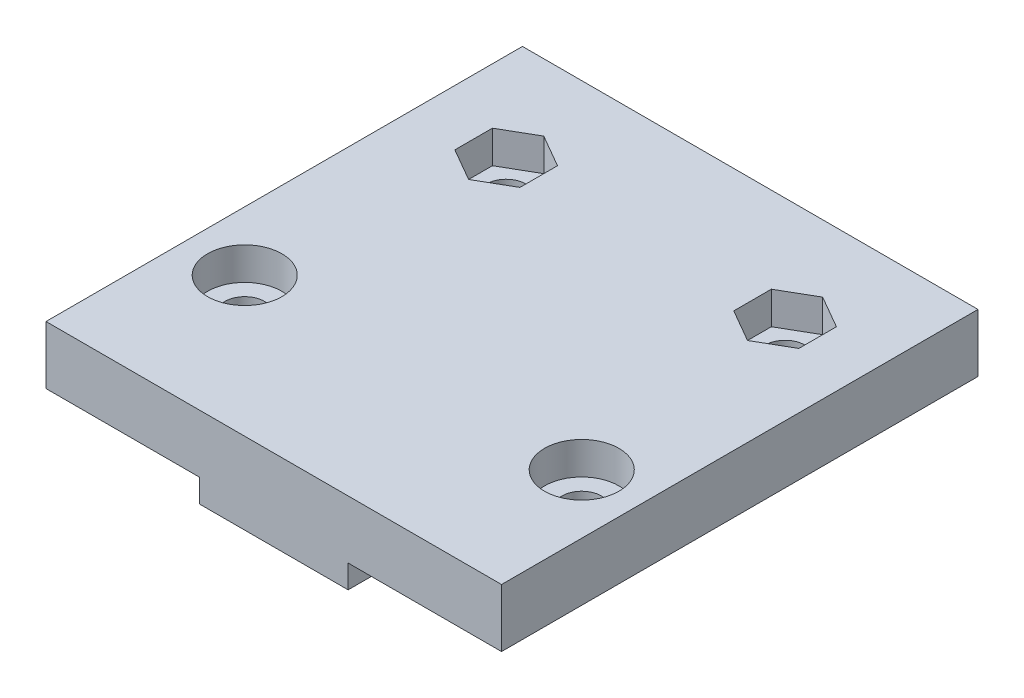
ISO-10303-21;
HEADER;
FILE_DESCRIPTION(('STEP AP214'),'2;1');
FILE_NAME('part.step','',(''),(''),'','','');
FILE_SCHEMA(('AUTOMOTIVE_DESIGN { 1 0 10303 214 1 1 1 1 }'));
ENDSEC;
DATA;
#1=APPLICATION_CONTEXT('core data for automotive mechanical design processes');
#2=APPLICATION_PROTOCOL_DEFINITION('international standard','automotive_design',2000,#1);
#3=PRODUCT_CONTEXT('',#1,'mechanical');
#4=PRODUCT('Part','Part','',(#3));
#5=PRODUCT_RELATED_PRODUCT_CATEGORY('part','',(#4));
#6=PRODUCT_DEFINITION_FORMATION('','',#4);
#7=PRODUCT_DEFINITION_CONTEXT('part definition',#1,'design');
#8=PRODUCT_DEFINITION('design','',#6,#7);
#9=PRODUCT_DEFINITION_SHAPE('','',#8);
#10=(LENGTH_UNIT() NAMED_UNIT(*) SI_UNIT(.MILLI.,.METRE.));
#11=(NAMED_UNIT(*) PLANE_ANGLE_UNIT() SI_UNIT($,.RADIAN.));
#12=(NAMED_UNIT(*) SI_UNIT($,.STERADIAN.) SOLID_ANGLE_UNIT());
#13=UNCERTAINTY_MEASURE_WITH_UNIT(LENGTH_MEASURE(1.E-05),#10,'distance_accuracy_value','');
#14=(GEOMETRIC_REPRESENTATION_CONTEXT(3) GLOBAL_UNCERTAINTY_ASSIGNED_CONTEXT((#13)) GLOBAL_UNIT_ASSIGNED_CONTEXT((#10,
#11,#12)) REPRESENTATION_CONTEXT('',''));
#15=CARTESIAN_POINT('',(0.,0.,0.));
#16=DIRECTION('',(0.,0.,1.));
#17=DIRECTION('',(1.,0.,0.));
#18=AXIS2_PLACEMENT_3D('',#15,#16,#17);
#19=CARTESIAN_POINT('',(14.5,22.5,-6.));
#20=DIRECTION('',(0.,-1.,0.));
#21=DIRECTION('',(1.,0.,0.));
#22=AXIS2_PLACEMENT_3D('',#19,#20,#21);
#23=CYLINDRICAL_SURFACE('',#22,1.7);
#24=CARTESIAN_POINT('',(14.5,5.,-6.));
#25=DIRECTION('',(0.,1.,0.));
#26=DIRECTION('',(-1.,0.,0.));
#27=AXIS2_PLACEMENT_3D('',#24,#25,#26);
#28=CIRCLE('',#27,1.7);
#29=CARTESIAN_POINT('',(12.8,5.,-6.));
#30=VERTEX_POINT('',#29);
#31=EDGE_CURVE('E244',#30,#30,#28,.F.);
#32=ORIENTED_EDGE('',*,*,#31,.T.);
#33=EDGE_LOOP('',(#32));
#34=FACE_BOUND('',#33,.T.);
#35=CARTESIAN_POINT('',(14.5,7.2,-6.));
#36=DIRECTION('',(0.,1.,0.));
#37=DIRECTION('',(-1.,0.,0.));
#38=AXIS2_PLACEMENT_3D('',#35,#36,#37);
#39=CIRCLE('',#38,1.7);
#40=CARTESIAN_POINT('',(12.8,7.2,-6.));
#41=VERTEX_POINT('',#40);
#42=EDGE_CURVE('E255',#41,#41,#39,.F.);
#43=ORIENTED_EDGE('',*,*,#42,.F.);
#44=EDGE_LOOP('',(#43));
#45=FACE_BOUND('',#44,.T.);
#46=ADVANCED_FACE('F35',(#34,#45),#23,.F.);
#47=CARTESIAN_POINT('',(-12.,22.5,-26.));
#48=DIRECTION('',(0.,-1.,0.));
#49=DIRECTION('',(1.,0.,0.));
#50=AXIS2_PLACEMENT_3D('',#47,#48,#49);
#51=CYLINDRICAL_SURFACE('',#50,1.7);
#52=CARTESIAN_POINT('',(-12.,5.,-26.));
#53=DIRECTION('',(0.,1.,0.));
#54=DIRECTION('',(-1.,0.,0.));
#55=AXIS2_PLACEMENT_3D('',#52,#53,#54);
#56=CIRCLE('',#55,1.7);
#57=CARTESIAN_POINT('',(-13.7,5.,-26.));
#58=VERTEX_POINT('',#57);
#59=EDGE_CURVE('E231',#58,#58,#56,.F.);
#60=ORIENTED_EDGE('',*,*,#59,.T.);
#61=EDGE_LOOP('',(#60));
#62=FACE_BOUND('',#61,.T.);
#63=CARTESIAN_POINT('',(-12.,7.2,-26.));
#64=DIRECTION('',(0.,1.,0.));
#65=DIRECTION('',(0.,0.,1.));
#66=AXIS2_PLACEMENT_3D('',#63,#64,#65);
#67=CIRCLE('',#66,1.7);
#68=CARTESIAN_POINT('',(-12.,7.2,-24.3));
#69=VERTEX_POINT('',#68);
#70=EDGE_CURVE('E249',#69,#69,#67,.F.);
#71=ORIENTED_EDGE('',*,*,#70,.F.);
#72=EDGE_LOOP('',(#71));
#73=FACE_BOUND('',#72,.T.);
#74=ADVANCED_FACE('F493',(#62,#73),#51,.F.);
#75=CARTESIAN_POINT('',(0.,0.,6.));
#76=DIRECTION('',(0.,0.,1.));
#77=DIRECTION('',(1.,0.,0.));
#78=AXIS2_PLACEMENT_3D('',#75,#76,#77);
#79=PLANE('',#78);
#80=DIRECTION('',(0.,1.,0.));
#81=VECTOR('',#80,1.);
#82=CARTESIAN_POINT('',(19.6,-36.0019511730844,6.));
#83=LINE('',#82,#81);
#84=CARTESIAN_POINT('',(19.6,5.,6.));
#85=VERTEX_POINT('',#84);
#86=CARTESIAN_POINT('',(19.6,10.,6.));
#87=VERTEX_POINT('',#86);
#88=EDGE_CURVE('E60',#85,#87,#83,.T.);
#89=ORIENTED_EDGE('',*,*,#88,.T.);
#90=DIRECTION('',(-1.,0.,0.));
#91=VECTOR('',#90,1.);
#92=CARTESIAN_POINT('',(20.,10.,6.));
#93=LINE('',#92,#91);
#94=CARTESIAN_POINT('',(-19.6,10.,6.));
#95=VERTEX_POINT('',#94);
#96=EDGE_CURVE('E44',#87,#95,#93,.T.);
#97=ORIENTED_EDGE('',*,*,#96,.T.);
#98=DIRECTION('',(0.,1.,0.));
#99=VECTOR('',#98,1.);
#100=CARTESIAN_POINT('',(-19.6,-36.0019511730844,6.));
#101=LINE('',#100,#99);
#102=CARTESIAN_POINT('',(-19.6,5.,6.));
#103=VERTEX_POINT('',#102);
#104=EDGE_CURVE('E353',#103,#95,#101,.T.);
#105=ORIENTED_EDGE('',*,*,#104,.F.);
#106=DIRECTION('',(-1.,0.,0.));
#107=VECTOR('',#106,1.);
#108=CARTESIAN_POINT('',(-20.,4.99999999999999,6.));
#109=LINE('',#108,#107);
#110=CARTESIAN_POINT('',(-6.4,5.,6.));
#111=VERTEX_POINT('',#110);
#112=EDGE_CURVE('E243',#111,#103,#109,.T.);
#113=ORIENTED_EDGE('',*,*,#112,.F.);
#114=DIRECTION('',(0.,-1.,0.));
#115=VECTOR('',#114,1.);
#116=CARTESIAN_POINT('',(-6.40000000000001,49.0113621693308,6.));
#117=LINE('',#116,#115);
#118=CARTESIAN_POINT('',(-6.4,3.,6.));
#119=VERTEX_POINT('',#118);
#120=EDGE_CURVE('E326',#111,#119,#117,.T.);
#121=ORIENTED_EDGE('',*,*,#120,.T.);
#122=DIRECTION('',(-1.,0.,0.));
#123=VECTOR('',#122,1.);
#124=CARTESIAN_POINT('',(-7.,3.,6.));
#125=LINE('',#124,#123);
#126=CARTESIAN_POINT('',(6.4,3.,6.));
#127=VERTEX_POINT('',#126);
#128=EDGE_CURVE('E238',#127,#119,#125,.T.);
#129=ORIENTED_EDGE('',*,*,#128,.F.);
#130=DIRECTION('',(0.,-1.,0.));
#131=VECTOR('',#130,1.);
#132=CARTESIAN_POINT('',(6.40000000000001,49.0113621693308,6.));
#133=LINE('',#132,#131);
#134=CARTESIAN_POINT('',(6.4,5.,6.));
#135=VERTEX_POINT('',#134);
#136=EDGE_CURVE('E302',#135,#127,#133,.T.);
#137=ORIENTED_EDGE('',*,*,#136,.F.);
#138=DIRECTION('',(1.,0.,0.));
#139=VECTOR('',#138,1.);
#140=CARTESIAN_POINT('',(20.,5.,6.));
#141=LINE('',#140,#139);
#142=EDGE_CURVE('E310',#135,#85,#141,.T.);
#143=ORIENTED_EDGE('',*,*,#142,.T.);
#144=EDGE_LOOP('',(#89,#97,#105,#113,#121,#129,#137,#143));
#145=FACE_BOUND('',#144,.T.);
#146=ADVANCED_FACE('F469',(#145),#79,.T.);
#147=CARTESIAN_POINT('',(0.,0.,-35.));
#148=DIRECTION('',(0.,0.,1.));
#149=DIRECTION('',(1.,0.,0.));
#150=AXIS2_PLACEMENT_3D('',#147,#148,#149);
#151=PLANE('',#150);
#152=DIRECTION('',(0.,-1.,0.));
#153=VECTOR('',#152,1.);
#154=CARTESIAN_POINT('',(4.00000000000001,49.0113621693308,-35.));
#155=LINE('',#154,#153);
#156=CARTESIAN_POINT('',(4.,5.,-35.));
#157=VERTEX_POINT('',#156);
#158=CARTESIAN_POINT('',(4.,4.,-35.));
#159=VERTEX_POINT('',#158);
#160=EDGE_CURVE('E212',#157,#159,#155,.T.);
#161=ORIENTED_EDGE('',*,*,#160,.T.);
#162=DIRECTION('',(1.,0.,0.));
#163=VECTOR('',#162,1.);
#164=CARTESIAN_POINT('',(4.,4.,-35.));
#165=LINE('',#164,#163);
#166=CARTESIAN_POINT('',(-4.,4.,-35.));
#167=VERTEX_POINT('',#166);
#168=EDGE_CURVE('E52',#167,#159,#165,.T.);
#169=ORIENTED_EDGE('',*,*,#168,.F.);
#170=DIRECTION('',(0.,-1.,0.));
#171=VECTOR('',#170,1.);
#172=CARTESIAN_POINT('',(-4.00000000000001,49.0113621693308,-35.));
#173=LINE('',#172,#171);
#174=CARTESIAN_POINT('',(-4.,5.,-35.));
#175=VERTEX_POINT('',#174);
#176=EDGE_CURVE('E210',#175,#167,#173,.T.);
#177=ORIENTED_EDGE('',*,*,#176,.F.);
#178=DIRECTION('',(1.,0.,0.));
#179=VECTOR('',#178,1.);
#180=CARTESIAN_POINT('',(-4.,5.,-35.));
#181=LINE('',#180,#179);
#182=CARTESIAN_POINT('',(-19.6,5.,-35.));
#183=VERTEX_POINT('',#182);
#184=EDGE_CURVE('E218',#183,#175,#181,.T.);
#185=ORIENTED_EDGE('',*,*,#184,.F.);
#186=DIRECTION('',(0.,1.,0.));
#187=VECTOR('',#186,1.);
#188=CARTESIAN_POINT('',(-19.6,-36.0019511730844,-35.));
#189=LINE('',#188,#187);
#190=CARTESIAN_POINT('',(-19.6,10.,-35.));
#191=VERTEX_POINT('',#190);
#192=EDGE_CURVE('E349',#183,#191,#189,.T.);
#193=ORIENTED_EDGE('',*,*,#192,.T.);
#194=DIRECTION('',(-1.,0.,0.));
#195=VECTOR('',#194,1.);
#196=CARTESIAN_POINT('',(-20.,10.,-35.));
#197=LINE('',#196,#195);
#198=CARTESIAN_POINT('',(19.6,10.,-35.));
#199=VERTEX_POINT('',#198);
#200=EDGE_CURVE('E230',#199,#191,#197,.T.);
#201=ORIENTED_EDGE('',*,*,#200,.F.);
#202=DIRECTION('',(0.,1.,0.));
#203=VECTOR('',#202,1.);
#204=CARTESIAN_POINT('',(19.6,-36.0019511730844,-35.));
#205=LINE('',#204,#203);
#206=CARTESIAN_POINT('',(19.6,5.00000000000001,-35.));
#207=VERTEX_POINT('',#206);
#208=EDGE_CURVE('E475',#207,#199,#205,.T.);
#209=ORIENTED_EDGE('',*,*,#208,.F.);
#210=DIRECTION('',(-1.,0.,0.));
#211=VECTOR('',#210,1.);
#212=CARTESIAN_POINT('',(4.00000000000002,5.,-35.));
#213=LINE('',#212,#211);
#214=EDGE_CURVE('E308',#207,#157,#213,.T.);
#215=ORIENTED_EDGE('',*,*,#214,.T.);
#216=EDGE_LOOP('',(#161,#169,#177,#185,#193,#201,#209,#215));
#217=FACE_BOUND('',#216,.T.);
#218=ADVANCED_FACE('F208',(#217),#151,.F.);
#219=CARTESIAN_POINT('',(7.,3.,-0.999999999999997));
#220=DIRECTION('',(0.,0.,1.));
#221=DIRECTION('',(1.,0.,0.));
#222=AXIS2_PLACEMENT_3D('',#219,#220,#221);
#223=PLANE('',#222);
#224=DIRECTION('',(0.,-1.,0.));
#225=VECTOR('',#224,1.);
#226=CARTESIAN_POINT('',(6.40000000000001,49.0113621693308,-0.999999999999999));
#227=LINE('',#226,#225);
#228=CARTESIAN_POINT('',(6.4,5.,-0.999999999999999));
#229=VERTEX_POINT('',#228);
#230=CARTESIAN_POINT('',(6.4,3.,-0.999999999999999));
#231=VERTEX_POINT('',#230);
#232=EDGE_CURVE('E303',#229,#231,#227,.T.);
#233=ORIENTED_EDGE('',*,*,#232,.T.);
#234=DIRECTION('',(1.,0.,0.));
#235=VECTOR('',#234,1.);
#236=CARTESIAN_POINT('',(0.,3.,-0.999999999999998));
#237=LINE('',#236,#235);
#238=CARTESIAN_POINT('',(-6.4,3.,-0.999999999999999));
#239=VERTEX_POINT('',#238);
#240=EDGE_CURVE('E11',#239,#231,#237,.T.);
#241=ORIENTED_EDGE('',*,*,#240,.F.);
#242=DIRECTION('',(0.,-1.,0.));
#243=VECTOR('',#242,1.);
#244=CARTESIAN_POINT('',(-6.40000000000001,49.0113621693308,-0.999999999999999));
#245=LINE('',#244,#243);
#246=CARTESIAN_POINT('',(-6.4,5.,-0.999999999999999));
#247=VERTEX_POINT('',#246);
#248=EDGE_CURVE('E329',#247,#239,#245,.T.);
#249=ORIENTED_EDGE('',*,*,#248,.F.);
#250=DIRECTION('',(-1.,0.,0.));
#251=VECTOR('',#250,1.);
#252=CARTESIAN_POINT('',(-9.,5.,-0.999999999999999));
#253=LINE('',#252,#251);
#254=EDGE_CURVE('E236',#229,#247,#253,.T.);
#255=ORIENTED_EDGE('',*,*,#254,.F.);
#256=EDGE_LOOP('',(#233,#241,#249,#255));
#257=FACE_BOUND('',#256,.T.);
#258=ADVANCED_FACE('F517',(#257),#223,.F.);
#259=CARTESIAN_POINT('',(6.5,3.,-33.));
#260=DIRECTION('',(0.,0.,-1.));
#261=DIRECTION('',(-1.,0.,0.));
#262=AXIS2_PLACEMENT_3D('',#259,#260,#261);
#263=PLANE('',#262);
#264=DIRECTION('',(0.,-1.,0.));
#265=VECTOR('',#264,1.);
#266=CARTESIAN_POINT('',(-4.00000000000001,49.0113621693308,-33.));
#267=LINE('',#266,#265);
#268=CARTESIAN_POINT('',(-4.,5.,-33.));
#269=VERTEX_POINT('',#268);
#270=CARTESIAN_POINT('',(-4.,4.,-33.));
#271=VERTEX_POINT('',#270);
#272=EDGE_CURVE('E220',#269,#271,#267,.T.);
#273=ORIENTED_EDGE('',*,*,#272,.T.);
#274=DIRECTION('',(-1.,0.,0.));
#275=VECTOR('',#274,1.);
#276=CARTESIAN_POINT('',(4.,4.,-33.));
#277=LINE('',#276,#275);
#278=CARTESIAN_POINT('',(4.,4.,-33.));
#279=VERTEX_POINT('',#278);
#280=EDGE_CURVE('E199',#279,#271,#277,.T.);
#281=ORIENTED_EDGE('',*,*,#280,.F.);
#282=DIRECTION('',(0.,-1.,0.));
#283=VECTOR('',#282,1.);
#284=CARTESIAN_POINT('',(4.00000000000001,49.0113621693308,-33.));
#285=LINE('',#284,#283);
#286=CARTESIAN_POINT('',(4.,5.,-33.));
#287=VERTEX_POINT('',#286);
#288=EDGE_CURVE('E314',#287,#279,#285,.T.);
#289=ORIENTED_EDGE('',*,*,#288,.F.);
#290=DIRECTION('',(1.,0.,0.));
#291=VECTOR('',#290,1.);
#292=CARTESIAN_POINT('',(6.5,5.,-33.));
#293=LINE('',#292,#291);
#294=EDGE_CURVE('E233',#269,#287,#293,.T.);
#295=ORIENTED_EDGE('',*,*,#294,.F.);
#296=EDGE_LOOP('',(#273,#281,#289,#295));
#297=FACE_BOUND('',#296,.T.);
#298=ADVANCED_FACE('F338',(#297),#263,.F.);
#299=CARTESIAN_POINT('',(0.,3.,0.));
#300=DIRECTION('',(0.,1.,0.));
#301=DIRECTION('',(-1.,0.,0.));
#302=AXIS2_PLACEMENT_3D('',#299,#300,#301);
#303=PLANE('',#302);
#304=DIRECTION('',(0.,0.,1.));
#305=VECTOR('',#304,1.);
#306=CARTESIAN_POINT('',(6.4,3.,6.));
#307=LINE('',#306,#305);
#308=EDGE_CURVE('E299',#231,#127,#307,.T.);
#309=ORIENTED_EDGE('',*,*,#308,.T.);
#310=ORIENTED_EDGE('',*,*,#128,.T.);
#311=DIRECTION('',(0.,0.,1.));
#312=VECTOR('',#311,1.);
#313=CARTESIAN_POINT('',(-6.4,3.,6.));
#314=LINE('',#313,#312);
#315=EDGE_CURVE('E222',#239,#119,#314,.T.);
#316=ORIENTED_EDGE('',*,*,#315,.F.);
#317=ORIENTED_EDGE('',*,*,#240,.T.);
#318=EDGE_LOOP('',(#309,#310,#316,#317));
#319=FACE_BOUND('',#318,.T.);
#320=ADVANCED_FACE('F461',(#319),#303,.F.);
#321=CARTESIAN_POINT('',(20.,10.,6.));
#322=DIRECTION('',(0.,-1.,0.));
#323=DIRECTION('',(1.,0.,0.));
#324=AXIS2_PLACEMENT_3D('',#321,#322,#323);
#325=PLANE('',#324);
#326=DIRECTION('',(0.866025403784439,0.,0.5));
#327=VECTOR('',#326,1.);
#328=CARTESIAN_POINT('',(12.,10.,-22.7668384925381));
#329=LINE('',#328,#327);
#330=CARTESIAN_POINT('',(9.2,10.,-24.3834192462691));
#331=VERTEX_POINT('',#330);
#332=CARTESIAN_POINT('',(12.,10.,-22.7668384925381));
#333=VERTEX_POINT('',#332);
#334=EDGE_CURVE('E383',#331,#333,#329,.T.);
#335=ORIENTED_EDGE('',*,*,#334,.F.);
#336=DIRECTION('',(0.,0.,1.));
#337=VECTOR('',#336,1.);
#338=CARTESIAN_POINT('',(9.2,10.,-24.3834192462691));
#339=LINE('',#338,#337);
#340=CARTESIAN_POINT('',(9.2,10.,-27.616580753731));
#341=VERTEX_POINT('',#340);
#342=EDGE_CURVE('E381',#341,#331,#339,.T.);
#343=ORIENTED_EDGE('',*,*,#342,.F.);
#344=DIRECTION('',(-0.866025403784439,0.,0.5));
#345=VECTOR('',#344,1.);
#346=CARTESIAN_POINT('',(9.2,10.,-27.616580753731));
#347=LINE('',#346,#345);
#348=CARTESIAN_POINT('',(12.,10.,-29.2331615074619));
#349=VERTEX_POINT('',#348);
#350=EDGE_CURVE('E365',#349,#341,#347,.T.);
#351=ORIENTED_EDGE('',*,*,#350,.F.);
#352=DIRECTION('',(-0.866025403784439,0.,-0.5));
#353=VECTOR('',#352,1.);
#354=CARTESIAN_POINT('',(12.,10.,-29.2331615074619));
#355=LINE('',#354,#353);
#356=CARTESIAN_POINT('',(14.8,10.,-27.616580753731));
#357=VERTEX_POINT('',#356);
#358=EDGE_CURVE('E393',#357,#349,#355,.T.);
#359=ORIENTED_EDGE('',*,*,#358,.F.);
#360=DIRECTION('',(0.,0.,-1.));
#361=VECTOR('',#360,1.);
#362=CARTESIAN_POINT('',(14.8,10.,-27.616580753731));
#363=LINE('',#362,#361);
#364=CARTESIAN_POINT('',(14.8,10.,-24.383419246269));
#365=VERTEX_POINT('',#364);
#366=EDGE_CURVE('E390',#365,#357,#363,.T.);
#367=ORIENTED_EDGE('',*,*,#366,.F.);
#368=DIRECTION('',(0.866025403784439,0.,-0.499999999999999));
#369=VECTOR('',#368,1.);
#370=CARTESIAN_POINT('',(14.8,10.,-24.383419246269));
#371=LINE('',#370,#369);
#372=EDGE_CURVE('E387',#333,#365,#371,.T.);
#373=ORIENTED_EDGE('',*,*,#372,.F.);
#374=EDGE_LOOP('',(#335,#343,#351,#359,#367,#373));
#375=FACE_BOUND('',#374,.T.);
#376=CARTESIAN_POINT('',(14.5,10.,-6.));
#377=DIRECTION('',(0.,1.,0.));
#378=DIRECTION('',(-1.,0.,0.));
#379=AXIS2_PLACEMENT_3D('',#376,#377,#378);
#380=CIRCLE('',#379,3.2);
#381=CARTESIAN_POINT('',(11.3,10.,-6.));
#382=VERTEX_POINT('',#381);
#383=EDGE_CURVE('E411',#382,#382,#380,.T.);
#384=ORIENTED_EDGE('',*,*,#383,.F.);
#385=EDGE_LOOP('',(#384));
#386=FACE_BOUND('',#385,.T.);
#387=CARTESIAN_POINT('',(-14.5,10.,-6.));
#388=DIRECTION('',(0.,1.,0.));
#389=DIRECTION('',(1.,0.,0.));
#390=AXIS2_PLACEMENT_3D('',#387,#388,#389);
#391=CIRCLE('',#390,3.2);
#392=CARTESIAN_POINT('',(-11.3,10.,-6.));
#393=VERTEX_POINT('',#392);
#394=EDGE_CURVE('E417',#393,#393,#391,.T.);
#395=ORIENTED_EDGE('',*,*,#394,.F.);
#396=EDGE_LOOP('',(#395));
#397=FACE_BOUND('',#396,.T.);
#398=DIRECTION('',(-0.866025403784438,0.,0.500000000000001));
#399=VECTOR('',#398,1.);
#400=CARTESIAN_POINT('',(-12.,10.,-29.2331615074619));
#401=LINE('',#400,#399);
#402=CARTESIAN_POINT('',(-12.,10.,-29.2331615074619));
#403=VERTEX_POINT('',#402);
#404=CARTESIAN_POINT('',(-14.8,10.,-27.616580753731));
#405=VERTEX_POINT('',#404);
#406=EDGE_CURVE('E264',#403,#405,#401,.T.);
#407=ORIENTED_EDGE('',*,*,#406,.F.);
#408=DIRECTION('',(-0.866025403784439,0.,-0.5));
#409=VECTOR('',#408,1.);
#410=CARTESIAN_POINT('',(-9.2,10.,-27.616580753731));
#411=LINE('',#410,#409);
#412=CARTESIAN_POINT('',(-9.2,10.,-27.616580753731));
#413=VERTEX_POINT('',#412);
#414=EDGE_CURVE('E261',#413,#403,#411,.T.);
#415=ORIENTED_EDGE('',*,*,#414,.F.);
#416=DIRECTION('',(0.,0.,-1.));
#417=VECTOR('',#416,1.);
#418=CARTESIAN_POINT('',(-9.2,10.,-24.3834192462691));
#419=LINE('',#418,#417);
#420=CARTESIAN_POINT('',(-9.2,10.,-24.3834192462691));
#421=VERTEX_POINT('',#420);
#422=EDGE_CURVE('E284',#421,#413,#419,.T.);
#423=ORIENTED_EDGE('',*,*,#422,.F.);
#424=DIRECTION('',(0.866025403784439,0.,-0.5));
#425=VECTOR('',#424,1.);
#426=CARTESIAN_POINT('',(-12.,10.,-22.7668384925381));
#427=LINE('',#426,#425);
#428=CARTESIAN_POINT('',(-12.,10.,-22.7668384925381));
#429=VERTEX_POINT('',#428);
#430=EDGE_CURVE('E281',#429,#421,#427,.T.);
#431=ORIENTED_EDGE('',*,*,#430,.F.);
#432=DIRECTION('',(0.866025403784439,0.,0.499999999999999));
#433=VECTOR('',#432,1.);
#434=CARTESIAN_POINT('',(-14.8,10.,-24.383419246269));
#435=LINE('',#434,#433);
#436=CARTESIAN_POINT('',(-14.8,10.,-24.383419246269));
#437=VERTEX_POINT('',#436);
#438=EDGE_CURVE('E278',#437,#429,#435,.T.);
#439=ORIENTED_EDGE('',*,*,#438,.F.);
#440=DIRECTION('',(0.,0.,1.));
#441=VECTOR('',#440,1.);
#442=CARTESIAN_POINT('',(-14.8,10.,-27.616580753731));
#443=LINE('',#442,#441);
#444=EDGE_CURVE('E270',#405,#437,#443,.T.);
#445=ORIENTED_EDGE('',*,*,#444,.F.);
#446=EDGE_LOOP('',(#407,#415,#423,#431,#439,#445));
#447=FACE_BOUND('',#446,.T.);
#448=ORIENTED_EDGE('',*,*,#96,.F.);
#449=DIRECTION('',(0.,0.,1.));
#450=VECTOR('',#449,1.);
#451=CARTESIAN_POINT('',(19.6,10.,-35.));
#452=LINE('',#451,#450);
#453=EDGE_CURVE('E466',#199,#87,#452,.T.);
#454=ORIENTED_EDGE('',*,*,#453,.F.);
#455=ORIENTED_EDGE('',*,*,#200,.T.);
#456=DIRECTION('',(0.,0.,-1.));
#457=VECTOR('',#456,1.);
#458=CARTESIAN_POINT('',(-19.6,10.,-35.));
#459=LINE('',#458,#457);
#460=EDGE_CURVE('E354',#95,#191,#459,.T.);
#461=ORIENTED_EDGE('',*,*,#460,.F.);
#462=EDGE_LOOP('',(#448,#454,#455,#461));
#463=FACE_BOUND('',#462,.T.);
#464=ADVANCED_FACE('F37',(#375,#386,#397,#447,#463),#325,.F.);
#465=CARTESIAN_POINT('',(0.,5.,0.));
#466=DIRECTION('',(0.,1.,0.));
#467=DIRECTION('',(-1.,0.,0.));
#468=AXIS2_PLACEMENT_3D('',#465,#466,#467);
#469=PLANE('',#468);
#470=ORIENTED_EDGE('',*,*,#214,.F.);
#471=DIRECTION('',(0.,0.,-1.));
#472=VECTOR('',#471,1.);
#473=CARTESIAN_POINT('',(19.6,5.00000000000001,-35.));
#474=LINE('',#473,#472);
#475=EDGE_CURVE('E358',#85,#207,#474,.T.);
#476=ORIENTED_EDGE('',*,*,#475,.F.);
#477=ORIENTED_EDGE('',*,*,#142,.F.);
#478=DIRECTION('',(0.,0.,1.));
#479=VECTOR('',#478,1.);
#480=CARTESIAN_POINT('',(6.4,5.,6.));
#481=LINE('',#480,#479);
#482=EDGE_CURVE('E248',#229,#135,#481,.T.);
#483=ORIENTED_EDGE('',*,*,#482,.F.);
#484=ORIENTED_EDGE('',*,*,#254,.T.);
#485=DIRECTION('',(0.,0.,1.));
#486=VECTOR('',#485,1.);
#487=CARTESIAN_POINT('',(-6.4,5.,6.));
#488=LINE('',#487,#486);
#489=EDGE_CURVE('E327',#247,#111,#488,.T.);
#490=ORIENTED_EDGE('',*,*,#489,.T.);
#491=ORIENTED_EDGE('',*,*,#112,.T.);
#492=DIRECTION('',(0.,0.,1.));
#493=VECTOR('',#492,1.);
#494=CARTESIAN_POINT('',(-19.6,5.,-35.));
#495=LINE('',#494,#493);
#496=EDGE_CURVE('E346',#183,#103,#495,.T.);
#497=ORIENTED_EDGE('',*,*,#496,.F.);
#498=ORIENTED_EDGE('',*,*,#184,.T.);
#499=DIRECTION('',(0.,0.,1.));
#500=VECTOR('',#499,1.);
#501=CARTESIAN_POINT('',(-4.,5.,-33.));
#502=LINE('',#501,#500);
#503=EDGE_CURVE('E217',#175,#269,#502,.T.);
#504=ORIENTED_EDGE('',*,*,#503,.T.);
#505=ORIENTED_EDGE('',*,*,#294,.T.);
#506=DIRECTION('',(0.,0.,1.));
#507=VECTOR('',#506,1.);
#508=CARTESIAN_POINT('',(4.,5.,-33.));
#509=LINE('',#508,#507);
#510=EDGE_CURVE('E306',#157,#287,#509,.T.);
#511=ORIENTED_EDGE('',*,*,#510,.F.);
#512=EDGE_LOOP('',(#470,#476,#477,#483,#484,#490,#491,#497,#498,#504,#505,#511));
#513=FACE_BOUND('',#512,.T.);
#514=CARTESIAN_POINT('',(-14.5,5.,-6.));
#515=DIRECTION('',(0.,1.,0.));
#516=DIRECTION('',(-1.,0.,0.));
#517=AXIS2_PLACEMENT_3D('',#514,#515,#516);
#518=CIRCLE('',#517,1.7);
#519=CARTESIAN_POINT('',(-16.2,5.,-6.));
#520=VERTEX_POINT('',#519);
#521=EDGE_CURVE('E227',#520,#520,#518,.F.);
#522=ORIENTED_EDGE('',*,*,#521,.F.);
#523=EDGE_LOOP('',(#522));
#524=FACE_BOUND('',#523,.T.);
#525=ORIENTED_EDGE('',*,*,#59,.F.);
#526=EDGE_LOOP('',(#525));
#527=FACE_BOUND('',#526,.T.);
#528=ORIENTED_EDGE('',*,*,#31,.F.);
#529=EDGE_LOOP('',(#528));
#530=FACE_BOUND('',#529,.T.);
#531=CARTESIAN_POINT('',(12.,5.,-26.));
#532=DIRECTION('',(0.,1.,0.));
#533=DIRECTION('',(-1.,0.,0.));
#534=AXIS2_PLACEMENT_3D('',#531,#532,#533);
#535=CIRCLE('',#534,1.7);
#536=CARTESIAN_POINT('',(10.3,5.,-26.));
#537=VERTEX_POINT('',#536);
#538=EDGE_CURVE('E247',#537,#537,#535,.F.);
#539=ORIENTED_EDGE('',*,*,#538,.F.);
#540=EDGE_LOOP('',(#539));
#541=FACE_BOUND('',#540,.T.);
#542=ADVANCED_FACE('F342',(#513,#524,#527,#530,#541),#469,.F.);
#543=CARTESIAN_POINT('',(12.,22.5,-26.));
#544=DIRECTION('',(0.,-1.,0.));
#545=DIRECTION('',(1.,0.,0.));
#546=AXIS2_PLACEMENT_3D('',#543,#544,#545);
#547=CYLINDRICAL_SURFACE('',#546,1.7);
#548=CARTESIAN_POINT('',(12.,7.2,-26.));
#549=DIRECTION('',(0.,-1.,0.));
#550=DIRECTION('',(0.,0.,-1.));
#551=AXIS2_PLACEMENT_3D('',#548,#549,#550);
#552=CIRCLE('',#551,1.7);
#553=CARTESIAN_POINT('',(12.,7.2,-27.7));
#554=VERTEX_POINT('',#553);
#555=EDGE_CURVE('E39',#554,#554,#552,.F.);
#556=ORIENTED_EDGE('',*,*,#555,.T.);
#557=EDGE_LOOP('',(#556));
#558=FACE_BOUND('',#557,.T.);
#559=ORIENTED_EDGE('',*,*,#538,.T.);
#560=EDGE_LOOP('',(#559));
#561=FACE_BOUND('',#560,.T.);
#562=ADVANCED_FACE('F508',(#558,#561),#547,.F.);
#563=CARTESIAN_POINT('',(-14.5,22.5,-6.));
#564=DIRECTION('',(0.,-1.,0.));
#565=DIRECTION('',(1.,0.,0.));
#566=AXIS2_PLACEMENT_3D('',#563,#564,#565);
#567=CYLINDRICAL_SURFACE('',#566,1.7);
#568=CARTESIAN_POINT('',(-14.5,7.2,-6.));
#569=DIRECTION('',(0.,-1.,0.));
#570=DIRECTION('',(1.,0.,0.));
#571=AXIS2_PLACEMENT_3D('',#568,#569,#570);
#572=CIRCLE('',#571,1.7);
#573=CARTESIAN_POINT('',(-12.8,7.2,-6.));
#574=VERTEX_POINT('',#573);
#575=EDGE_CURVE('E253',#574,#574,#572,.F.);
#576=ORIENTED_EDGE('',*,*,#575,.T.);
#577=EDGE_LOOP('',(#576));
#578=FACE_BOUND('',#577,.T.);
#579=ORIENTED_EDGE('',*,*,#521,.T.);
#580=EDGE_LOOP('',(#579));
#581=FACE_BOUND('',#580,.T.);
#582=ADVANCED_FACE('F505',(#578,#581),#567,.F.);
#583=CARTESIAN_POINT('',(-4.00000000000001,49.0113621693308,-33.));
#584=DIRECTION('',(1.,0.,0.));
#585=DIRECTION('',(0.,1.,0.));
#586=AXIS2_PLACEMENT_3D('',#583,#584,#585);
#587=PLANE('',#586);
#588=ORIENTED_EDGE('',*,*,#176,.T.);
#589=DIRECTION('',(0.,0.,-1.));
#590=VECTOR('',#589,1.);
#591=CARTESIAN_POINT('',(-4.,4.,-24.9377422517015));
#592=LINE('',#591,#590);
#593=EDGE_CURVE('E196',#271,#167,#592,.T.);
#594=ORIENTED_EDGE('',*,*,#593,.F.);
#595=ORIENTED_EDGE('',*,*,#272,.F.);
#596=ORIENTED_EDGE('',*,*,#503,.F.);
#597=EDGE_LOOP('',(#588,#594,#595,#596));
#598=FACE_BOUND('',#597,.T.);
#599=ADVANCED_FACE('F215',(#598),#587,.F.);
#600=CARTESIAN_POINT('',(-6.40000000000001,49.0113621693308,6.));
#601=DIRECTION('',(1.,0.,0.));
#602=DIRECTION('',(0.,1.,0.));
#603=AXIS2_PLACEMENT_3D('',#600,#601,#602);
#604=PLANE('',#603);
#605=ORIENTED_EDGE('',*,*,#248,.T.);
#606=ORIENTED_EDGE('',*,*,#315,.T.);
#607=ORIENTED_EDGE('',*,*,#120,.F.);
#608=ORIENTED_EDGE('',*,*,#489,.F.);
#609=EDGE_LOOP('',(#605,#606,#607,#608));
#610=FACE_BOUND('',#609,.T.);
#611=ADVANCED_FACE('F579',(#610),#604,.F.);
#612=CARTESIAN_POINT('',(4.00000000000001,49.0113621693308,-33.));
#613=DIRECTION('',(1.,0.,0.));
#614=DIRECTION('',(0.,1.,0.));
#615=AXIS2_PLACEMENT_3D('',#612,#613,#614);
#616=PLANE('',#615);
#617=DIRECTION('',(0.,0.,-1.));
#618=VECTOR('',#617,1.);
#619=CARTESIAN_POINT('',(4.,4.,-24.9377422517015));
#620=LINE('',#619,#618);
#621=EDGE_CURVE('E203',#279,#159,#620,.T.);
#622=ORIENTED_EDGE('',*,*,#621,.T.);
#623=ORIENTED_EDGE('',*,*,#160,.F.);
#624=ORIENTED_EDGE('',*,*,#510,.T.);
#625=ORIENTED_EDGE('',*,*,#288,.T.);
#626=EDGE_LOOP('',(#622,#623,#624,#625));
#627=FACE_BOUND('',#626,.T.);
#628=ADVANCED_FACE('F481',(#627),#616,.T.);
#629=CARTESIAN_POINT('',(6.40000000000001,49.0113621693308,6.));
#630=DIRECTION('',(1.,0.,0.));
#631=DIRECTION('',(0.,1.,0.));
#632=AXIS2_PLACEMENT_3D('',#629,#630,#631);
#633=PLANE('',#632);
#634=ORIENTED_EDGE('',*,*,#482,.T.);
#635=ORIENTED_EDGE('',*,*,#136,.T.);
#636=ORIENTED_EDGE('',*,*,#308,.F.);
#637=ORIENTED_EDGE('',*,*,#232,.F.);
#638=EDGE_LOOP('',(#634,#635,#636,#637));
#639=FACE_BOUND('',#638,.T.);
#640=ADVANCED_FACE('F592',(#639),#633,.T.);
#641=CARTESIAN_POINT('',(0.,7.2,0.));
#642=DIRECTION('',(0.,1.,0.));
#643=DIRECTION('',(0.,0.,1.));
#644=AXIS2_PLACEMENT_3D('',#641,#642,#643);
#645=PLANE('',#644);
#646=DIRECTION('',(-0.866025403784439,0.,-0.5));
#647=VECTOR('',#646,1.);
#648=CARTESIAN_POINT('',(-9.2,7.2,-27.616580753731));
#649=LINE('',#648,#647);
#650=CARTESIAN_POINT('',(-9.2,7.2,-27.616580753731));
#651=VERTEX_POINT('',#650);
#652=CARTESIAN_POINT('',(-12.,7.2,-29.2331615074619));
#653=VERTEX_POINT('',#652);
#654=EDGE_CURVE('E287',#651,#653,#649,.T.);
#655=ORIENTED_EDGE('',*,*,#654,.T.);
#656=DIRECTION('',(-0.866025403784438,0.,0.500000000000001));
#657=VECTOR('',#656,1.);
#658=CARTESIAN_POINT('',(-12.,7.2,-29.2331615074619));
#659=LINE('',#658,#657);
#660=CARTESIAN_POINT('',(-14.8,7.2,-27.616580753731));
#661=VERTEX_POINT('',#660);
#662=EDGE_CURVE('E422',#653,#661,#659,.T.);
#663=ORIENTED_EDGE('',*,*,#662,.T.);
#664=DIRECTION('',(0.,0.,1.));
#665=VECTOR('',#664,1.);
#666=CARTESIAN_POINT('',(-14.8,7.2,-27.616580753731));
#667=LINE('',#666,#665);
#668=CARTESIAN_POINT('',(-14.8,7.2,-24.383419246269));
#669=VERTEX_POINT('',#668);
#670=EDGE_CURVE('E425',#661,#669,#667,.T.);
#671=ORIENTED_EDGE('',*,*,#670,.T.);
#672=DIRECTION('',(0.866025403784439,0.,0.499999999999999));
#673=VECTOR('',#672,1.);
#674=CARTESIAN_POINT('',(-14.8,7.2,-24.383419246269));
#675=LINE('',#674,#673);
#676=CARTESIAN_POINT('',(-12.,7.2,-22.7668384925381));
#677=VERTEX_POINT('',#676);
#678=EDGE_CURVE('E428',#669,#677,#675,.T.);
#679=ORIENTED_EDGE('',*,*,#678,.T.);
#680=DIRECTION('',(0.866025403784439,0.,-0.5));
#681=VECTOR('',#680,1.);
#682=CARTESIAN_POINT('',(-12.,7.2,-22.7668384925381));
#683=LINE('',#682,#681);
#684=CARTESIAN_POINT('',(-9.2,7.2,-24.3834192462691));
#685=VERTEX_POINT('',#684);
#686=EDGE_CURVE('E430',#677,#685,#683,.T.);
#687=ORIENTED_EDGE('',*,*,#686,.T.);
#688=DIRECTION('',(0.,0.,-1.));
#689=VECTOR('',#688,1.);
#690=CARTESIAN_POINT('',(-9.2,7.2,-24.3834192462691));
#691=LINE('',#690,#689);
#692=EDGE_CURVE('E273',#685,#651,#691,.T.);
#693=ORIENTED_EDGE('',*,*,#692,.T.);
#694=EDGE_LOOP('',(#655,#663,#671,#679,#687,#693));
#695=FACE_BOUND('',#694,.T.);
#696=ORIENTED_EDGE('',*,*,#70,.T.);
#697=EDGE_LOOP('',(#696));
#698=FACE_BOUND('',#697,.T.);
#699=ADVANCED_FACE('F436',(#695,#698),#645,.T.);
#700=CARTESIAN_POINT('',(-9.2,7.2,-27.616580753731));
#701=DIRECTION('',(0.5,0.,-0.866025403784439));
#702=DIRECTION('',(-0.866025403784439,0.,-0.5));
#703=AXIS2_PLACEMENT_3D('',#700,#701,#702);
#704=PLANE('',#703);
#705=ORIENTED_EDGE('',*,*,#414,.T.);
#706=DIRECTION('',(0.,1.,0.));
#707=VECTOR('',#706,1.);
#708=CARTESIAN_POINT('',(-12.,7.2,-29.2331615074619));
#709=LINE('',#708,#707);
#710=EDGE_CURVE('E297',#653,#403,#709,.T.);
#711=ORIENTED_EDGE('',*,*,#710,.F.);
#712=ORIENTED_EDGE('',*,*,#654,.F.);
#713=DIRECTION('',(0.,1.,0.));
#714=VECTOR('',#713,1.);
#715=CARTESIAN_POINT('',(-9.2,7.2,-27.616580753731));
#716=LINE('',#715,#714);
#717=EDGE_CURVE('E252',#651,#413,#716,.T.);
#718=ORIENTED_EDGE('',*,*,#717,.T.);
#719=EDGE_LOOP('',(#705,#711,#712,#718));
#720=FACE_BOUND('',#719,.T.);
#721=ADVANCED_FACE('F442',(#720),#704,.F.);
#722=CARTESIAN_POINT('',(-9.2,7.2,-24.3834192462691));
#723=DIRECTION('',(1.,0.,0.));
#724=DIRECTION('',(0.,1.,0.));
#725=AXIS2_PLACEMENT_3D('',#722,#723,#724);
#726=PLANE('',#725);
#727=ORIENTED_EDGE('',*,*,#422,.T.);
#728=ORIENTED_EDGE('',*,*,#717,.F.);
#729=ORIENTED_EDGE('',*,*,#692,.F.);
#730=DIRECTION('',(0.,1.,0.));
#731=VECTOR('',#730,1.);
#732=CARTESIAN_POINT('',(-9.2,7.2,-24.3834192462691));
#733=LINE('',#732,#731);
#734=EDGE_CURVE('E289',#685,#421,#733,.T.);
#735=ORIENTED_EDGE('',*,*,#734,.T.);
#736=EDGE_LOOP('',(#727,#728,#729,#735));
#737=FACE_BOUND('',#736,.T.);
#738=ADVANCED_FACE('F440',(#737),#726,.F.);
#739=CARTESIAN_POINT('',(-12.,7.2,-22.7668384925381));
#740=DIRECTION('',(0.5,0.,0.866025403784439));
#741=DIRECTION('',(0.866025403784439,0.,-0.5));
#742=AXIS2_PLACEMENT_3D('',#739,#740,#741);
#743=PLANE('',#742);
#744=ORIENTED_EDGE('',*,*,#430,.T.);
#745=ORIENTED_EDGE('',*,*,#734,.F.);
#746=ORIENTED_EDGE('',*,*,#686,.F.);
#747=DIRECTION('',(0.,1.,0.));
#748=VECTOR('',#747,1.);
#749=CARTESIAN_POINT('',(-12.,7.2,-22.7668384925381));
#750=LINE('',#749,#748);
#751=EDGE_CURVE('E291',#677,#429,#750,.T.);
#752=ORIENTED_EDGE('',*,*,#751,.T.);
#753=EDGE_LOOP('',(#744,#745,#746,#752));
#754=FACE_BOUND('',#753,.T.);
#755=ADVANCED_FACE('F457',(#754),#743,.F.);
#756=CARTESIAN_POINT('',(-14.8,7.2,-24.383419246269));
#757=DIRECTION('',(-0.499999999999999,0.,0.866025403784439));
#758=DIRECTION('',(0.866025403784439,0.,0.499999999999999));
#759=AXIS2_PLACEMENT_3D('',#756,#757,#758);
#760=PLANE('',#759);
#761=ORIENTED_EDGE('',*,*,#438,.T.);
#762=ORIENTED_EDGE('',*,*,#751,.F.);
#763=ORIENTED_EDGE('',*,*,#678,.F.);
#764=DIRECTION('',(0.,1.,0.));
#765=VECTOR('',#764,1.);
#766=CARTESIAN_POINT('',(-14.8,7.2,-24.383419246269));
#767=LINE('',#766,#765);
#768=EDGE_CURVE('E293',#669,#437,#767,.T.);
#769=ORIENTED_EDGE('',*,*,#768,.T.);
#770=EDGE_LOOP('',(#761,#762,#763,#769));
#771=FACE_BOUND('',#770,.T.);
#772=ADVANCED_FACE('F454',(#771),#760,.F.);
#773=CARTESIAN_POINT('',(-14.8,7.2,-27.616580753731));
#774=DIRECTION('',(-1.,0.,0.));
#775=DIRECTION('',(0.,-1.,0.));
#776=AXIS2_PLACEMENT_3D('',#773,#774,#775);
#777=PLANE('',#776);
#778=ORIENTED_EDGE('',*,*,#444,.T.);
#779=ORIENTED_EDGE('',*,*,#768,.F.);
#780=ORIENTED_EDGE('',*,*,#670,.F.);
#781=DIRECTION('',(0.,1.,0.));
#782=VECTOR('',#781,1.);
#783=CARTESIAN_POINT('',(-14.8,7.2,-27.616580753731));
#784=LINE('',#783,#782);
#785=EDGE_CURVE('E295',#661,#405,#784,.T.);
#786=ORIENTED_EDGE('',*,*,#785,.T.);
#787=EDGE_LOOP('',(#778,#779,#780,#786));
#788=FACE_BOUND('',#787,.T.);
#789=ADVANCED_FACE('F450',(#788),#777,.F.);
#790=CARTESIAN_POINT('',(-12.,7.2,-29.2331615074619));
#791=DIRECTION('',(-0.500000000000001,0.,-0.866025403784438));
#792=DIRECTION('',(-0.866025403784438,0.,0.500000000000001));
#793=AXIS2_PLACEMENT_3D('',#790,#791,#792);
#794=PLANE('',#793);
#795=ORIENTED_EDGE('',*,*,#406,.T.);
#796=ORIENTED_EDGE('',*,*,#785,.F.);
#797=ORIENTED_EDGE('',*,*,#662,.F.);
#798=ORIENTED_EDGE('',*,*,#710,.T.);
#799=EDGE_LOOP('',(#795,#796,#797,#798));
#800=FACE_BOUND('',#799,.T.);
#801=ADVANCED_FACE('F446',(#800),#794,.F.);
#802=CARTESIAN_POINT('',(-14.5,7.2,-6.));
#803=DIRECTION('',(0.,-1.,0.));
#804=DIRECTION('',(1.,0.,0.));
#805=AXIS2_PLACEMENT_3D('',#802,#803,#804);
#806=PLANE('',#805);
#807=CARTESIAN_POINT('',(-14.5,7.2,-6.));
#808=DIRECTION('',(0.,1.,0.));
#809=DIRECTION('',(1.,0.,0.));
#810=AXIS2_PLACEMENT_3D('',#807,#808,#809);
#811=CIRCLE('',#810,3.2);
#812=CARTESIAN_POINT('',(-11.3,7.2,-6.));
#813=VERTEX_POINT('',#812);
#814=EDGE_CURVE('E414',#813,#813,#811,.T.);
#815=ORIENTED_EDGE('',*,*,#814,.T.);
#816=EDGE_LOOP('',(#815));
#817=FACE_BOUND('',#816,.T.);
#818=ORIENTED_EDGE('',*,*,#575,.F.);
#819=EDGE_LOOP('',(#818));
#820=FACE_BOUND('',#819,.T.);
#821=ADVANCED_FACE('F642',(#817,#820),#806,.F.);
#822=CARTESIAN_POINT('',(-14.5,7.2,-6.));
#823=DIRECTION('',(0.,1.,0.));
#824=DIRECTION('',(-1.,0.,0.));
#825=AXIS2_PLACEMENT_3D('',#822,#823,#824);
#826=CYLINDRICAL_SURFACE('',#825,3.2);
#827=ORIENTED_EDGE('',*,*,#814,.F.);
#828=EDGE_LOOP('',(#827));
#829=FACE_BOUND('',#828,.T.);
#830=ORIENTED_EDGE('',*,*,#394,.T.);
#831=EDGE_LOOP('',(#830));
#832=FACE_BOUND('',#831,.T.);
#833=ADVANCED_FACE('F649',(#829,#832),#826,.F.);
#834=CARTESIAN_POINT('',(14.5,7.2,-6.));
#835=DIRECTION('',(0.,1.,0.));
#836=DIRECTION('',(-1.,0.,0.));
#837=AXIS2_PLACEMENT_3D('',#834,#835,#836);
#838=PLANE('',#837);
#839=CARTESIAN_POINT('',(14.5,7.2,-6.));
#840=DIRECTION('',(0.,1.,0.));
#841=DIRECTION('',(-1.,0.,0.));
#842=AXIS2_PLACEMENT_3D('',#839,#840,#841);
#843=CIRCLE('',#842,3.2);
#844=CARTESIAN_POINT('',(11.3,7.2,-6.));
#845=VERTEX_POINT('',#844);
#846=EDGE_CURVE('E384',#845,#845,#843,.T.);
#847=ORIENTED_EDGE('',*,*,#846,.T.);
#848=EDGE_LOOP('',(#847));
#849=FACE_BOUND('',#848,.T.);
#850=ORIENTED_EDGE('',*,*,#42,.T.);
#851=EDGE_LOOP('',(#850));
#852=FACE_BOUND('',#851,.T.);
#853=ADVANCED_FACE('F657',(#849,#852),#838,.T.);
#854=CARTESIAN_POINT('',(14.5,7.2,-6.));
#855=DIRECTION('',(0.,1.,0.));
#856=DIRECTION('',(-1.,0.,0.));
#857=AXIS2_PLACEMENT_3D('',#854,#855,#856);
#858=CYLINDRICAL_SURFACE('',#857,3.2);
#859=ORIENTED_EDGE('',*,*,#846,.F.);
#860=EDGE_LOOP('',(#859));
#861=FACE_BOUND('',#860,.T.);
#862=ORIENTED_EDGE('',*,*,#383,.T.);
#863=EDGE_LOOP('',(#862));
#864=FACE_BOUND('',#863,.T.);
#865=ADVANCED_FACE('F665',(#861,#864),#858,.F.);
#866=CARTESIAN_POINT('',(0.,7.2,0.));
#867=DIRECTION('',(0.,-1.,0.));
#868=DIRECTION('',(0.,0.,-1.));
#869=AXIS2_PLACEMENT_3D('',#866,#867,#868);
#870=PLANE('',#869);
#871=DIRECTION('',(0.,0.,1.));
#872=VECTOR('',#871,1.);
#873=CARTESIAN_POINT('',(9.2,7.2,-24.3834192462691));
#874=LINE('',#873,#872);
#875=CARTESIAN_POINT('',(9.2,7.2,-27.616580753731));
#876=VERTEX_POINT('',#875);
#877=CARTESIAN_POINT('',(9.2,7.2,-24.3834192462691));
#878=VERTEX_POINT('',#877);
#879=EDGE_CURVE('E361',#876,#878,#874,.T.);
#880=ORIENTED_EDGE('',*,*,#879,.T.);
#881=DIRECTION('',(0.866025403784439,0.,0.5));
#882=VECTOR('',#881,1.);
#883=CARTESIAN_POINT('',(12.,7.2,-22.7668384925381));
#884=LINE('',#883,#882);
#885=CARTESIAN_POINT('',(12.,7.2,-22.7668384925381));
#886=VERTEX_POINT('',#885);
#887=EDGE_CURVE('E364',#878,#886,#884,.T.);
#888=ORIENTED_EDGE('',*,*,#887,.T.);
#889=DIRECTION('',(0.866025403784439,0.,-0.499999999999999));
#890=VECTOR('',#889,1.);
#891=CARTESIAN_POINT('',(14.8,7.2,-24.383419246269));
#892=LINE('',#891,#890);
#893=CARTESIAN_POINT('',(14.8,7.2,-24.383419246269));
#894=VERTEX_POINT('',#893);
#895=EDGE_CURVE('E368',#886,#894,#892,.T.);
#896=ORIENTED_EDGE('',*,*,#895,.T.);
#897=DIRECTION('',(0.,0.,-1.));
#898=VECTOR('',#897,1.);
#899=CARTESIAN_POINT('',(14.8,7.2,-27.616580753731));
#900=LINE('',#899,#898);
#901=CARTESIAN_POINT('',(14.8,7.2,-27.616580753731));
#902=VERTEX_POINT('',#901);
#903=EDGE_CURVE('E371',#894,#902,#900,.T.);
#904=ORIENTED_EDGE('',*,*,#903,.T.);
#905=DIRECTION('',(-0.866025403784439,0.,-0.5));
#906=VECTOR('',#905,1.);
#907=CARTESIAN_POINT('',(12.,7.2,-29.2331615074619));
#908=LINE('',#907,#906);
#909=CARTESIAN_POINT('',(12.,7.2,-29.2331615074619));
#910=VERTEX_POINT('',#909);
#911=EDGE_CURVE('E374',#902,#910,#908,.T.);
#912=ORIENTED_EDGE('',*,*,#911,.T.);
#913=DIRECTION('',(-0.866025403784439,0.,0.5));
#914=VECTOR('',#913,1.);
#915=CARTESIAN_POINT('',(9.2,7.2,-27.616580753731));
#916=LINE('',#915,#914);
#917=EDGE_CURVE('E377',#910,#876,#916,.T.);
#918=ORIENTED_EDGE('',*,*,#917,.T.);
#919=EDGE_LOOP('',(#880,#888,#896,#904,#912,#918));
#920=FACE_BOUND('',#919,.T.);
#921=ORIENTED_EDGE('',*,*,#555,.F.);
#922=EDGE_LOOP('',(#921));
#923=FACE_BOUND('',#922,.T.);
#924=ADVANCED_FACE('F673',(#920,#923),#870,.F.);
#925=CARTESIAN_POINT('',(9.2,7.2,-24.3834192462691));
#926=DIRECTION('',(-1.,0.,0.));
#927=DIRECTION('',(0.,-1.,0.));
#928=AXIS2_PLACEMENT_3D('',#925,#926,#927);
#929=PLANE('',#928);
#930=ORIENTED_EDGE('',*,*,#342,.T.);
#931=DIRECTION('',(0.,1.,0.));
#932=VECTOR('',#931,1.);
#933=CARTESIAN_POINT('',(9.2,7.2,-24.3834192462691));
#934=LINE('',#933,#932);
#935=EDGE_CURVE('E380',#878,#331,#934,.T.);
#936=ORIENTED_EDGE('',*,*,#935,.F.);
#937=ORIENTED_EDGE('',*,*,#879,.F.);
#938=DIRECTION('',(0.,1.,0.));
#939=VECTOR('',#938,1.);
#940=CARTESIAN_POINT('',(9.2,7.2,-27.616580753731));
#941=LINE('',#940,#939);
#942=EDGE_CURVE('E256',#876,#341,#941,.T.);
#943=ORIENTED_EDGE('',*,*,#942,.T.);
#944=EDGE_LOOP('',(#930,#936,#937,#943));
#945=FACE_BOUND('',#944,.T.);
#946=ADVANCED_FACE('F681',(#945),#929,.F.);
#947=CARTESIAN_POINT('',(9.2,7.2,-27.616580753731));
#948=DIRECTION('',(-0.5,0.,-0.866025403784439));
#949=DIRECTION('',(-0.866025403784439,0.,0.5));
#950=AXIS2_PLACEMENT_3D('',#947,#948,#949);
#951=PLANE('',#950);
#952=ORIENTED_EDGE('',*,*,#350,.T.);
#953=ORIENTED_EDGE('',*,*,#942,.F.);
#954=ORIENTED_EDGE('',*,*,#917,.F.);
#955=DIRECTION('',(0.,1.,0.));
#956=VECTOR('',#955,1.);
#957=CARTESIAN_POINT('',(12.,7.2,-29.2331615074619));
#958=LINE('',#957,#956);
#959=EDGE_CURVE('E399',#910,#349,#958,.T.);
#960=ORIENTED_EDGE('',*,*,#959,.T.);
#961=EDGE_LOOP('',(#952,#953,#954,#960));
#962=FACE_BOUND('',#961,.T.);
#963=ADVANCED_FACE('F689',(#962),#951,.F.);
#964=CARTESIAN_POINT('',(12.,7.2,-29.2331615074619));
#965=DIRECTION('',(0.5,0.,-0.866025403784438));
#966=DIRECTION('',(-0.866025403784439,0.,-0.5));
#967=AXIS2_PLACEMENT_3D('',#964,#965,#966);
#968=PLANE('',#967);
#969=ORIENTED_EDGE('',*,*,#358,.T.);
#970=ORIENTED_EDGE('',*,*,#959,.F.);
#971=ORIENTED_EDGE('',*,*,#911,.F.);
#972=DIRECTION('',(0.,1.,0.));
#973=VECTOR('',#972,1.);
#974=CARTESIAN_POINT('',(14.8,7.2,-27.616580753731));
#975=LINE('',#974,#973);
#976=EDGE_CURVE('E401',#902,#357,#975,.T.);
#977=ORIENTED_EDGE('',*,*,#976,.T.);
#978=EDGE_LOOP('',(#969,#970,#971,#977));
#979=FACE_BOUND('',#978,.T.);
#980=ADVANCED_FACE('F697',(#979),#968,.F.);
#981=CARTESIAN_POINT('',(14.8,7.2,-27.616580753731));
#982=DIRECTION('',(1.,0.,0.));
#983=DIRECTION('',(0.,1.,0.));
#984=AXIS2_PLACEMENT_3D('',#981,#982,#983);
#985=PLANE('',#984);
#986=ORIENTED_EDGE('',*,*,#366,.T.);
#987=ORIENTED_EDGE('',*,*,#976,.F.);
#988=ORIENTED_EDGE('',*,*,#903,.F.);
#989=DIRECTION('',(0.,1.,0.));
#990=VECTOR('',#989,1.);
#991=CARTESIAN_POINT('',(14.8,7.2,-24.383419246269));
#992=LINE('',#991,#990);
#993=EDGE_CURVE('E403',#894,#365,#992,.T.);
#994=ORIENTED_EDGE('',*,*,#993,.T.);
#995=EDGE_LOOP('',(#986,#987,#988,#994));
#996=FACE_BOUND('',#995,.T.);
#997=ADVANCED_FACE('F705',(#996),#985,.F.);
#998=CARTESIAN_POINT('',(14.8,7.2,-24.383419246269));
#999=DIRECTION('',(0.499999999999999,0.,0.866025403784439));
#1000=DIRECTION('',(0.866025403784439,0.,-0.499999999999999));
#1001=AXIS2_PLACEMENT_3D('',#998,#999,#1000);
#1002=PLANE('',#1001);
#1003=ORIENTED_EDGE('',*,*,#372,.T.);
#1004=ORIENTED_EDGE('',*,*,#993,.F.);
#1005=ORIENTED_EDGE('',*,*,#895,.F.);
#1006=DIRECTION('',(0.,1.,0.));
#1007=VECTOR('',#1006,1.);
#1008=CARTESIAN_POINT('',(12.,7.2,-22.7668384925381));
#1009=LINE('',#1008,#1007);
#1010=EDGE_CURVE('E405',#886,#333,#1009,.T.);
#1011=ORIENTED_EDGE('',*,*,#1010,.T.);
#1012=EDGE_LOOP('',(#1003,#1004,#1005,#1011));
#1013=FACE_BOUND('',#1012,.T.);
#1014=ADVANCED_FACE('F713',(#1013),#1002,.F.);
#1015=CARTESIAN_POINT('',(12.,7.2,-22.7668384925381));
#1016=DIRECTION('',(-0.5,0.,0.866025403784439));
#1017=DIRECTION('',(0.866025403784439,0.,0.5));
#1018=AXIS2_PLACEMENT_3D('',#1015,#1016,#1017);
#1019=PLANE('',#1018);
#1020=ORIENTED_EDGE('',*,*,#334,.T.);
#1021=ORIENTED_EDGE('',*,*,#1010,.F.);
#1022=ORIENTED_EDGE('',*,*,#887,.F.);
#1023=ORIENTED_EDGE('',*,*,#935,.T.);
#1024=EDGE_LOOP('',(#1020,#1021,#1022,#1023));
#1025=FACE_BOUND('',#1024,.T.);
#1026=ADVANCED_FACE('F490',(#1025),#1019,.F.);
#1027=CARTESIAN_POINT('',(-19.6,-36.0019511730844,-35.));
#1028=DIRECTION('',(1.,0.,0.));
#1029=DIRECTION('',(0.,1.,0.));
#1030=AXIS2_PLACEMENT_3D('',#1027,#1028,#1029);
#1031=PLANE('',#1030);
#1032=ORIENTED_EDGE('',*,*,#496,.T.);
#1033=ORIENTED_EDGE('',*,*,#104,.T.);
#1034=ORIENTED_EDGE('',*,*,#460,.T.);
#1035=ORIENTED_EDGE('',*,*,#192,.F.);
#1036=EDGE_LOOP('',(#1032,#1033,#1034,#1035));
#1037=FACE_BOUND('',#1036,.T.);
#1038=ADVANCED_FACE('F471',(#1037),#1031,.F.);
#1039=CARTESIAN_POINT('',(19.6,-36.0019511730844,-35.));
#1040=DIRECTION('',(-1.,0.,0.));
#1041=DIRECTION('',(0.,-1.,0.));
#1042=AXIS2_PLACEMENT_3D('',#1039,#1040,#1041);
#1043=PLANE('',#1042);
#1044=ORIENTED_EDGE('',*,*,#475,.T.);
#1045=ORIENTED_EDGE('',*,*,#208,.T.);
#1046=ORIENTED_EDGE('',*,*,#453,.T.);
#1047=ORIENTED_EDGE('',*,*,#88,.F.);
#1048=EDGE_LOOP('',(#1044,#1045,#1046,#1047));
#1049=FACE_BOUND('',#1048,.T.);
#1050=ADVANCED_FACE('F482',(#1049),#1043,.F.);
#1051=CARTESIAN_POINT('',(4.,4.,-24.9377422517015));
#1052=DIRECTION('',(0.,1.,0.));
#1053=DIRECTION('',(0.,0.,1.));
#1054=AXIS2_PLACEMENT_3D('',#1051,#1052,#1053);
#1055=PLANE('',#1054);
#1056=ORIENTED_EDGE('',*,*,#280,.T.);
#1057=ORIENTED_EDGE('',*,*,#593,.T.);
#1058=ORIENTED_EDGE('',*,*,#168,.T.);
#1059=ORIENTED_EDGE('',*,*,#621,.F.);
#1060=EDGE_LOOP('',(#1056,#1057,#1058,#1059));
#1061=FACE_BOUND('',#1060,.T.);
#1062=ADVANCED_FACE('F197',(#1061),#1055,.F.);
#1063=CLOSED_SHELL('',(#46,#74,#146,#218,#258,#298,#320,#464,#542,#562,#582,#599,#611,#628,#640,
#699,#721,#738,#755,#772,#789,#801,#821,#833,#853,#865,#924,#946,#963,#980,#997,#1014,#1026,
#1038,#1050,#1062));
#1064=MANIFOLD_SOLID_BREP('B2',#1063);
#1065=ADVANCED_BREP_SHAPE_REPRESENTATION('',(#18,#1064),#14);
#1066=SHAPE_DEFINITION_REPRESENTATION(#9,#1065);
ENDSEC;
END-ISO-10303-21;
